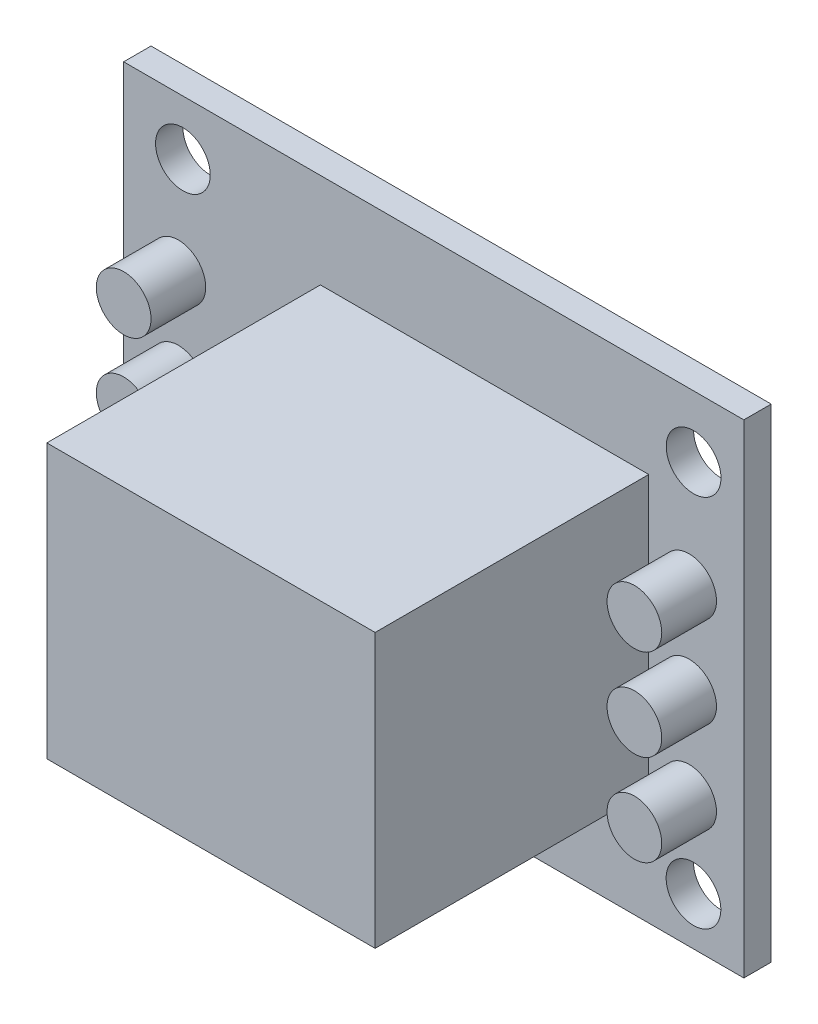
ISO-10303-21;
HEADER;
FILE_DESCRIPTION(('STEP AP214'),'2;1');
FILE_NAME('part.step','',(''),(''),'','','');
FILE_SCHEMA(('AUTOMOTIVE_DESIGN { 1 0 10303 214 1 1 1 1 }'));
ENDSEC;
DATA;
#1=APPLICATION_CONTEXT('core data for automotive mechanical design processes');
#2=APPLICATION_PROTOCOL_DEFINITION('international standard','automotive_design',2000,#1);
#3=PRODUCT_CONTEXT('',#1,'mechanical');
#4=PRODUCT('Part','Part','',(#3));
#5=PRODUCT_RELATED_PRODUCT_CATEGORY('part','',(#4));
#6=PRODUCT_DEFINITION_FORMATION('','',#4);
#7=PRODUCT_DEFINITION_CONTEXT('part definition',#1,'design');
#8=PRODUCT_DEFINITION('design','',#6,#7);
#9=PRODUCT_DEFINITION_SHAPE('','',#8);
#10=(LENGTH_UNIT() NAMED_UNIT(*) SI_UNIT(.MILLI.,.METRE.));
#11=(NAMED_UNIT(*) PLANE_ANGLE_UNIT() SI_UNIT($,.RADIAN.));
#12=(NAMED_UNIT(*) SI_UNIT($,.STERADIAN.) SOLID_ANGLE_UNIT());
#13=UNCERTAINTY_MEASURE_WITH_UNIT(LENGTH_MEASURE(1.E-05),#10,'distance_accuracy_value','');
#14=(GEOMETRIC_REPRESENTATION_CONTEXT(3) GLOBAL_UNCERTAINTY_ASSIGNED_CONTEXT((#13)) GLOBAL_UNIT_ASSIGNED_CONTEXT((#10,
#11,#12)) REPRESENTATION_CONTEXT('',''));
#15=CARTESIAN_POINT('',(0.,0.,0.));
#16=DIRECTION('',(0.,0.,1.));
#17=DIRECTION('',(1.,0.,0.));
#18=AXIS2_PLACEMENT_3D('',#15,#16,#17);
#19=CARTESIAN_POINT('',(0.,0.,1.5));
#20=DIRECTION('',(0.,0.,1.));
#21=DIRECTION('',(1.,0.,0.));
#22=AXIS2_PLACEMENT_3D('',#19,#20,#21);
#23=PLANE('',#22);
#24=CARTESIAN_POINT('',(16.28013764939,-5.89932861440915,1.5));
#25=DIRECTION('',(0.,0.,1.));
#26=DIRECTION('',(1.,0.,0.));
#27=AXIS2_PLACEMENT_3D('',#24,#25,#26);
#28=CIRCLE('',#27,1.5);
#29=CARTESIAN_POINT('',(17.78013764939,-5.89932861440915,1.5));
#30=VERTEX_POINT('',#29);
#31=EDGE_CURVE('E291',#30,#30,#28,.T.);
#32=ORIENTED_EDGE('',*,*,#31,.F.);
#33=EDGE_LOOP('',(#32));
#34=FACE_BOUND('',#33,.T.);
#35=CARTESIAN_POINT('',(16.28013764939,-0.899328614409152,1.5));
#36=DIRECTION('',(0.,0.,1.));
#37=DIRECTION('',(1.,0.,0.));
#38=AXIS2_PLACEMENT_3D('',#35,#36,#37);
#39=CIRCLE('',#38,1.5);
#40=CARTESIAN_POINT('',(17.78013764939,-0.899328614409152,1.5));
#41=VERTEX_POINT('',#40);
#42=EDGE_CURVE('E290',#41,#41,#39,.T.);
#43=ORIENTED_EDGE('',*,*,#42,.F.);
#44=EDGE_LOOP('',(#43));
#45=FACE_BOUND('',#44,.T.);
#46=CARTESIAN_POINT('',(16.28013764939,4.10067138559085,1.5));
#47=DIRECTION('',(0.,0.,1.));
#48=DIRECTION('',(1.,0.,0.));
#49=AXIS2_PLACEMENT_3D('',#46,#47,#48);
#50=CIRCLE('',#49,1.5);
#51=CARTESIAN_POINT('',(17.78013764939,4.10067138559085,1.5));
#52=VERTEX_POINT('',#51);
#53=EDGE_CURVE('E300',#52,#52,#50,.T.);
#54=ORIENTED_EDGE('',*,*,#53,.F.);
#55=EDGE_LOOP('',(#54));
#56=FACE_BOUND('',#55,.T.);
#57=CARTESIAN_POINT('',(-11.71986235061,-5.,1.5));
#58=DIRECTION('',(0.,0.,1.));
#59=DIRECTION('',(1.,0.,0.));
#60=AXIS2_PLACEMENT_3D('',#57,#58,#59);
#61=CIRCLE('',#60,1.5);
#62=CARTESIAN_POINT('',(-10.21986235061,-5.,1.5));
#63=VERTEX_POINT('',#62);
#64=EDGE_CURVE('E305',#63,#63,#61,.T.);
#65=ORIENTED_EDGE('',*,*,#64,.F.);
#66=EDGE_LOOP('',(#65));
#67=FACE_BOUND('',#66,.T.);
#68=CARTESIAN_POINT('',(-11.71986235061,0.,1.5));
#69=DIRECTION('',(0.,0.,1.));
#70=DIRECTION('',(1.,0.,0.));
#71=AXIS2_PLACEMENT_3D('',#68,#69,#70);
#72=CIRCLE('',#71,1.5);
#73=CARTESIAN_POINT('',(-10.21986235061,0.,1.5));
#74=VERTEX_POINT('',#73);
#75=EDGE_CURVE('E311',#74,#74,#72,.T.);
#76=ORIENTED_EDGE('',*,*,#75,.F.);
#77=EDGE_LOOP('',(#76));
#78=FACE_BOUND('',#77,.T.);
#79=CARTESIAN_POINT('',(-11.71986235061,5.,1.5));
#80=DIRECTION('',(0.,0.,1.));
#81=DIRECTION('',(1.,0.,0.));
#82=AXIS2_PLACEMENT_3D('',#79,#80,#81);
#83=CIRCLE('',#82,1.5);
#84=CARTESIAN_POINT('',(-10.21986235061,5.,1.5));
#85=VERTEX_POINT('',#84);
#86=EDGE_CURVE('E317',#85,#85,#83,.T.);
#87=ORIENTED_EDGE('',*,*,#86,.F.);
#88=EDGE_LOOP('',(#87));
#89=FACE_BOUND('',#88,.T.);
#90=CARTESIAN_POINT('',(16.52013764939,-10.4262328767123,1.5));
#91=DIRECTION('',(0.,0.,1.));
#92=DIRECTION('',(1.,0.,0.));
#93=AXIS2_PLACEMENT_3D('',#90,#91,#92);
#94=CIRCLE('',#93,1.5);
#95=CARTESIAN_POINT('',(18.02013764939,-10.4262328767123,1.5));
#96=VERTEX_POINT('',#95);
#97=EDGE_CURVE('E144',#96,#96,#94,.T.);
#98=ORIENTED_EDGE('',*,*,#97,.F.);
#99=EDGE_LOOP('',(#98));
#100=FACE_BOUND('',#99,.T.);
#101=CARTESIAN_POINT('',(-11.472215350492,10.4587665135316,1.5));
#102=DIRECTION('',(0.,0.,1.));
#103=DIRECTION('',(1.,0.,0.));
#104=AXIS2_PLACEMENT_3D('',#101,#102,#103);
#105=CIRCLE('',#104,1.5);
#106=CARTESIAN_POINT('',(-9.97221535049201,10.4587665135316,1.5));
#107=VERTEX_POINT('',#106);
#108=EDGE_CURVE('E156',#107,#107,#105,.T.);
#109=ORIENTED_EDGE('',*,*,#108,.F.);
#110=EDGE_LOOP('',(#109));
#111=FACE_BOUND('',#110,.T.);
#112=DIRECTION('',(0.,-1.,0.));
#113=VECTOR('',#112,1.);
#114=CARTESIAN_POINT('',(-14.71986235061,13.4587671232877,1.5));
#115=LINE('',#114,#113);
#116=CARTESIAN_POINT('',(-14.71986235061,13.4587671232877,1.5));
#117=VERTEX_POINT('',#116);
#118=CARTESIAN_POINT('',(-14.71986235061,-13.0412328767123,1.5));
#119=VERTEX_POINT('',#118);
#120=EDGE_CURVE('E162',#117,#119,#115,.T.);
#121=ORIENTED_EDGE('',*,*,#120,.T.);
#122=DIRECTION('',(1.,0.,0.));
#123=VECTOR('',#122,1.);
#124=CARTESIAN_POINT('',(-14.71986235061,-13.0412328767123,1.5));
#125=LINE('',#124,#123);
#126=CARTESIAN_POINT('',(19.28013764939,-13.0412328767123,1.5));
#127=VERTEX_POINT('',#126);
#128=EDGE_CURVE('E86',#119,#127,#125,.T.);
#129=ORIENTED_EDGE('',*,*,#128,.T.);
#130=DIRECTION('',(0.,1.,0.));
#131=VECTOR('',#130,1.);
#132=CARTESIAN_POINT('',(19.28013764939,13.4587671232877,1.5));
#133=LINE('',#132,#131);
#134=CARTESIAN_POINT('',(19.28013764939,13.4587671232877,1.5));
#135=VERTEX_POINT('',#134);
#136=EDGE_CURVE('E165',#127,#135,#133,.T.);
#137=ORIENTED_EDGE('',*,*,#136,.T.);
#138=DIRECTION('',(-1.,0.,0.));
#139=VECTOR('',#138,1.);
#140=CARTESIAN_POINT('',(-14.71986235061,13.4587671232877,1.5));
#141=LINE('',#140,#139);
#142=EDGE_CURVE('E58',#135,#117,#141,.T.);
#143=ORIENTED_EDGE('',*,*,#142,.T.);
#144=EDGE_LOOP('',(#121,#129,#137,#143));
#145=FACE_BOUND('',#144,.T.);
#146=CARTESIAN_POINT('',(-11.477215350492,-10.0412328767123,1.5));
#147=DIRECTION('',(0.,0.,1.));
#148=DIRECTION('',(1.,0.,0.));
#149=AXIS2_PLACEMENT_3D('',#146,#147,#148);
#150=CIRCLE('',#149,1.5);
#151=CARTESIAN_POINT('',(-9.97721535049202,-10.0412328767123,1.5));
#152=VERTEX_POINT('',#151);
#153=EDGE_CURVE('E150',#152,#152,#150,.T.);
#154=ORIENTED_EDGE('',*,*,#153,.F.);
#155=EDGE_LOOP('',(#154));
#156=FACE_BOUND('',#155,.T.);
#157=CARTESIAN_POINT('',(16.52513764939,10.0737665135316,1.5));
#158=DIRECTION('',(0.,0.,1.));
#159=DIRECTION('',(1.,0.,0.));
#160=AXIS2_PLACEMENT_3D('',#157,#158,#159);
#161=CIRCLE('',#160,1.5);
#162=CARTESIAN_POINT('',(18.02513764939,10.0737665135316,1.5));
#163=VERTEX_POINT('',#162);
#164=EDGE_CURVE('E136',#163,#163,#161,.T.);
#165=ORIENTED_EDGE('',*,*,#164,.F.);
#166=EDGE_LOOP('',(#165));
#167=FACE_BOUND('',#166,.T.);
#168=DIRECTION('',(1.,0.,0.));
#169=VECTOR('',#168,1.);
#170=CARTESIAN_POINT('',(-3.93328594625488,-6.74123287671233,1.5));
#171=LINE('',#170,#169);
#172=CARTESIAN_POINT('',(-3.93328594625488,-6.74123287671233,1.5));
#173=VERTEX_POINT('',#172);
#174=CARTESIAN_POINT('',(14.0667140537451,-6.74123287671233,1.5));
#175=VERTEX_POINT('',#174);
#176=EDGE_CURVE('E329',#173,#175,#171,.T.);
#177=ORIENTED_EDGE('',*,*,#176,.F.);
#178=DIRECTION('',(0.,-1.,0.));
#179=VECTOR('',#178,1.);
#180=CARTESIAN_POINT('',(-3.93328594625489,8.25876712328767,1.5));
#181=LINE('',#180,#179);
#182=CARTESIAN_POINT('',(-3.93328594625489,8.25876712328767,1.5));
#183=VERTEX_POINT('',#182);
#184=EDGE_CURVE('E131',#183,#173,#181,.T.);
#185=ORIENTED_EDGE('',*,*,#184,.F.);
#186=DIRECTION('',(-1.,0.,0.));
#187=VECTOR('',#186,1.);
#188=CARTESIAN_POINT('',(-3.93328594625489,8.25876712328767,1.5));
#189=LINE('',#188,#187);
#190=CARTESIAN_POINT('',(14.0667140537451,8.25876712328767,1.5));
#191=VERTEX_POINT('',#190);
#192=EDGE_CURVE('E127',#191,#183,#189,.T.);
#193=ORIENTED_EDGE('',*,*,#192,.F.);
#194=DIRECTION('',(0.,1.,0.));
#195=VECTOR('',#194,1.);
#196=CARTESIAN_POINT('',(14.0667140537451,8.25876712328767,1.5));
#197=LINE('',#196,#195);
#198=EDGE_CURVE('E331',#175,#191,#197,.T.);
#199=ORIENTED_EDGE('',*,*,#198,.F.);
#200=EDGE_LOOP('',(#177,#185,#193,#199));
#201=FACE_BOUND('',#200,.T.);
#202=ADVANCED_FACE('F34',(#34,#45,#56,#67,#78,#89,#100,#111,#145,#156,#167,#201),#23,.T.);
#203=CARTESIAN_POINT('',(0.,0.,0.));
#204=DIRECTION('',(0.,0.,1.));
#205=DIRECTION('',(1.,0.,0.));
#206=AXIS2_PLACEMENT_3D('',#203,#204,#205);
#207=PLANE('',#206);
#208=DIRECTION('',(0.,-1.,0.));
#209=VECTOR('',#208,1.);
#210=CARTESIAN_POINT('',(-14.71986235061,13.4587671232877,0.));
#211=LINE('',#210,#209);
#212=CARTESIAN_POINT('',(-14.71986235061,13.4587671232877,0.));
#213=VERTEX_POINT('',#212);
#214=CARTESIAN_POINT('',(-14.71986235061,-13.0412328767123,0.));
#215=VERTEX_POINT('',#214);
#216=EDGE_CURVE('E159',#213,#215,#211,.T.);
#217=ORIENTED_EDGE('',*,*,#216,.F.);
#218=DIRECTION('',(-1.,0.,0.));
#219=VECTOR('',#218,1.);
#220=CARTESIAN_POINT('',(-14.71986235061,13.4587671232877,0.));
#221=LINE('',#220,#219);
#222=CARTESIAN_POINT('',(19.28013764939,13.4587671232877,0.));
#223=VERTEX_POINT('',#222);
#224=EDGE_CURVE('E79',#223,#213,#221,.T.);
#225=ORIENTED_EDGE('',*,*,#224,.F.);
#226=DIRECTION('',(0.,1.,0.));
#227=VECTOR('',#226,1.);
#228=CARTESIAN_POINT('',(19.28013764939,13.4587671232877,0.));
#229=LINE('',#228,#227);
#230=CARTESIAN_POINT('',(19.28013764939,-13.0412328767123,0.));
#231=VERTEX_POINT('',#230);
#232=EDGE_CURVE('E173',#231,#223,#229,.T.);
#233=ORIENTED_EDGE('',*,*,#232,.F.);
#234=DIRECTION('',(1.,0.,0.));
#235=VECTOR('',#234,1.);
#236=CARTESIAN_POINT('',(-14.71986235061,-13.0412328767123,0.));
#237=LINE('',#236,#235);
#238=EDGE_CURVE('E171',#215,#231,#237,.T.);
#239=ORIENTED_EDGE('',*,*,#238,.F.);
#240=EDGE_LOOP('',(#217,#225,#233,#239));
#241=FACE_BOUND('',#240,.T.);
#242=CARTESIAN_POINT('',(-11.472215350492,10.4587665135316,0.));
#243=DIRECTION('',(0.,0.,1.));
#244=DIRECTION('',(1.,0.,0.));
#245=AXIS2_PLACEMENT_3D('',#242,#243,#244);
#246=CIRCLE('',#245,1.5);
#247=CARTESIAN_POINT('',(-9.97221535049201,10.4587665135316,0.));
#248=VERTEX_POINT('',#247);
#249=EDGE_CURVE('E153',#248,#248,#246,.T.);
#250=ORIENTED_EDGE('',*,*,#249,.T.);
#251=EDGE_LOOP('',(#250));
#252=FACE_BOUND('',#251,.T.);
#253=CARTESIAN_POINT('',(-11.477215350492,-10.0412328767123,0.));
#254=DIRECTION('',(0.,0.,1.));
#255=DIRECTION('',(1.,0.,0.));
#256=AXIS2_PLACEMENT_3D('',#253,#254,#255);
#257=CIRCLE('',#256,1.5);
#258=CARTESIAN_POINT('',(-9.97721535049202,-10.0412328767123,0.));
#259=VERTEX_POINT('',#258);
#260=EDGE_CURVE('E147',#259,#259,#257,.T.);
#261=ORIENTED_EDGE('',*,*,#260,.T.);
#262=EDGE_LOOP('',(#261));
#263=FACE_BOUND('',#262,.T.);
#264=CARTESIAN_POINT('',(16.52013764939,-10.4262328767123,0.));
#265=DIRECTION('',(0.,0.,1.));
#266=DIRECTION('',(1.,0.,0.));
#267=AXIS2_PLACEMENT_3D('',#264,#265,#266);
#268=CIRCLE('',#267,1.5);
#269=CARTESIAN_POINT('',(18.02013764939,-10.4262328767123,0.));
#270=VERTEX_POINT('',#269);
#271=EDGE_CURVE('E142',#270,#270,#268,.T.);
#272=ORIENTED_EDGE('',*,*,#271,.T.);
#273=EDGE_LOOP('',(#272));
#274=FACE_BOUND('',#273,.T.);
#275=CARTESIAN_POINT('',(16.52513764939,10.0737665135316,0.));
#276=DIRECTION('',(0.,0.,1.));
#277=DIRECTION('',(1.,0.,0.));
#278=AXIS2_PLACEMENT_3D('',#275,#276,#277);
#279=CIRCLE('',#278,1.5);
#280=CARTESIAN_POINT('',(18.02513764939,10.0737665135316,0.));
#281=VERTEX_POINT('',#280);
#282=EDGE_CURVE('E133',#281,#281,#279,.T.);
#283=ORIENTED_EDGE('',*,*,#282,.T.);
#284=EDGE_LOOP('',(#283));
#285=FACE_BOUND('',#284,.T.);
#286=ADVANCED_FACE('F186',(#241,#252,#263,#274,#285),#207,.F.);
#287=CARTESIAN_POINT('',(-14.71986235061,13.4587671232877,1.5));
#288=DIRECTION('',(1.,0.,0.));
#289=DIRECTION('',(0.,1.,0.));
#290=AXIS2_PLACEMENT_3D('',#287,#288,#289);
#291=PLANE('',#290);
#292=ORIENTED_EDGE('',*,*,#216,.T.);
#293=DIRECTION('',(0.,0.,-1.));
#294=VECTOR('',#293,1.);
#295=CARTESIAN_POINT('',(-14.71986235061,-13.0412328767123,1.5));
#296=LINE('',#295,#294);
#297=EDGE_CURVE('E11',#119,#215,#296,.T.);
#298=ORIENTED_EDGE('',*,*,#297,.F.);
#299=ORIENTED_EDGE('',*,*,#120,.F.);
#300=DIRECTION('',(0.,0.,-1.));
#301=VECTOR('',#300,1.);
#302=CARTESIAN_POINT('',(-14.71986235061,13.4587671232877,1.5));
#303=LINE('',#302,#301);
#304=EDGE_CURVE('E168',#117,#213,#303,.T.);
#305=ORIENTED_EDGE('',*,*,#304,.T.);
#306=EDGE_LOOP('',(#292,#298,#299,#305));
#307=FACE_BOUND('',#306,.T.);
#308=ADVANCED_FACE('F36',(#307),#291,.F.);
#309=CARTESIAN_POINT('',(-14.71986235061,-13.0412328767123,1.5));
#310=DIRECTION('',(0.,1.,0.));
#311=DIRECTION('',(0.,0.,1.));
#312=AXIS2_PLACEMENT_3D('',#309,#310,#311);
#313=PLANE('',#312);
#314=ORIENTED_EDGE('',*,*,#238,.T.);
#315=DIRECTION('',(0.,0.,-1.));
#316=VECTOR('',#315,1.);
#317=CARTESIAN_POINT('',(19.28013764939,-13.0412328767123,1.5));
#318=LINE('',#317,#316);
#319=EDGE_CURVE('E42',#127,#231,#318,.T.);
#320=ORIENTED_EDGE('',*,*,#319,.F.);
#321=ORIENTED_EDGE('',*,*,#128,.F.);
#322=ORIENTED_EDGE('',*,*,#297,.T.);
#323=EDGE_LOOP('',(#314,#320,#321,#322));
#324=FACE_BOUND('',#323,.T.);
#325=ADVANCED_FACE('F202',(#324),#313,.F.);
#326=CARTESIAN_POINT('',(19.28013764939,13.4587671232877,1.5));
#327=DIRECTION('',(-1.,0.,0.));
#328=DIRECTION('',(0.,-1.,0.));
#329=AXIS2_PLACEMENT_3D('',#326,#327,#328);
#330=PLANE('',#329);
#331=ORIENTED_EDGE('',*,*,#232,.T.);
#332=DIRECTION('',(0.,0.,-1.));
#333=VECTOR('',#332,1.);
#334=CARTESIAN_POINT('',(19.28013764939,13.4587671232877,1.5));
#335=LINE('',#334,#333);
#336=EDGE_CURVE('E177',#135,#223,#335,.T.);
#337=ORIENTED_EDGE('',*,*,#336,.F.);
#338=ORIENTED_EDGE('',*,*,#136,.F.);
#339=ORIENTED_EDGE('',*,*,#319,.T.);
#340=EDGE_LOOP('',(#331,#337,#338,#339));
#341=FACE_BOUND('',#340,.T.);
#342=ADVANCED_FACE('F182',(#341),#330,.F.);
#343=CARTESIAN_POINT('',(-14.71986235061,13.4587671232877,1.5));
#344=DIRECTION('',(0.,-1.,0.));
#345=DIRECTION('',(1.,0.,0.));
#346=AXIS2_PLACEMENT_3D('',#343,#344,#345);
#347=PLANE('',#346);
#348=ORIENTED_EDGE('',*,*,#224,.T.);
#349=ORIENTED_EDGE('',*,*,#304,.F.);
#350=ORIENTED_EDGE('',*,*,#142,.F.);
#351=ORIENTED_EDGE('',*,*,#336,.T.);
#352=EDGE_LOOP('',(#348,#349,#350,#351));
#353=FACE_BOUND('',#352,.T.);
#354=ADVANCED_FACE('F191',(#353),#347,.F.);
#355=CARTESIAN_POINT('',(-11.472215350492,10.4587665135316,1.5));
#356=DIRECTION('',(0.,0.,-1.));
#357=DIRECTION('',(-1.,0.,0.));
#358=AXIS2_PLACEMENT_3D('',#355,#356,#357);
#359=CYLINDRICAL_SURFACE('',#358,1.5);
#360=ORIENTED_EDGE('',*,*,#108,.T.);
#361=EDGE_LOOP('',(#360));
#362=FACE_BOUND('',#361,.T.);
#363=ORIENTED_EDGE('',*,*,#249,.F.);
#364=EDGE_LOOP('',(#363));
#365=FACE_BOUND('',#364,.T.);
#366=ADVANCED_FACE('F193',(#362,#365),#359,.F.);
#367=CARTESIAN_POINT('',(-11.477215350492,-10.0412328767123,1.5));
#368=DIRECTION('',(0.,0.,-1.));
#369=DIRECTION('',(-1.,0.,0.));
#370=AXIS2_PLACEMENT_3D('',#367,#368,#369);
#371=CYLINDRICAL_SURFACE('',#370,1.5);
#372=ORIENTED_EDGE('',*,*,#153,.T.);
#373=EDGE_LOOP('',(#372));
#374=FACE_BOUND('',#373,.T.);
#375=ORIENTED_EDGE('',*,*,#260,.F.);
#376=EDGE_LOOP('',(#375));
#377=FACE_BOUND('',#376,.T.);
#378=ADVANCED_FACE('F199',(#374,#377),#371,.F.);
#379=CARTESIAN_POINT('',(16.52013764939,-10.4262328767123,1.5));
#380=DIRECTION('',(0.,0.,-1.));
#381=DIRECTION('',(-1.,0.,0.));
#382=AXIS2_PLACEMENT_3D('',#379,#380,#381);
#383=CYLINDRICAL_SURFACE('',#382,1.5);
#384=ORIENTED_EDGE('',*,*,#97,.T.);
#385=EDGE_LOOP('',(#384));
#386=FACE_BOUND('',#385,.T.);
#387=ORIENTED_EDGE('',*,*,#271,.F.);
#388=EDGE_LOOP('',(#387));
#389=FACE_BOUND('',#388,.T.);
#390=ADVANCED_FACE('F216',(#386,#389),#383,.F.);
#391=CARTESIAN_POINT('',(16.52513764939,10.0737665135316,1.5));
#392=DIRECTION('',(0.,0.,-1.));
#393=DIRECTION('',(-1.,0.,0.));
#394=AXIS2_PLACEMENT_3D('',#391,#392,#393);
#395=CYLINDRICAL_SURFACE('',#394,1.5);
#396=ORIENTED_EDGE('',*,*,#164,.T.);
#397=EDGE_LOOP('',(#396));
#398=FACE_BOUND('',#397,.T.);
#399=ORIENTED_EDGE('',*,*,#282,.F.);
#400=EDGE_LOOP('',(#399));
#401=FACE_BOUND('',#400,.T.);
#402=ADVANCED_FACE('F220',(#398,#401),#395,.F.);
#403=CARTESIAN_POINT('',(-3.93328594625489,8.25876712328767,16.5));
#404=DIRECTION('',(1.,0.,0.));
#405=DIRECTION('',(0.,1.,0.));
#406=AXIS2_PLACEMENT_3D('',#403,#404,#405);
#407=PLANE('',#406);
#408=ORIENTED_EDGE('',*,*,#184,.T.);
#409=DIRECTION('',(0.,0.,-1.));
#410=VECTOR('',#409,1.);
#411=CARTESIAN_POINT('',(-3.93328594625488,-6.74123287671233,16.5));
#412=LINE('',#411,#410);
#413=CARTESIAN_POINT('',(-3.93328594625488,-6.74123287671233,16.5));
#414=VERTEX_POINT('',#413);
#415=EDGE_CURVE('E112',#414,#173,#412,.T.);
#416=ORIENTED_EDGE('',*,*,#415,.F.);
#417=DIRECTION('',(0.,-1.,0.));
#418=VECTOR('',#417,1.);
#419=CARTESIAN_POINT('',(-3.93328594625489,8.25876712328767,16.5));
#420=LINE('',#419,#418);
#421=CARTESIAN_POINT('',(-3.93328594625489,8.25876712328767,16.5));
#422=VERTEX_POINT('',#421);
#423=EDGE_CURVE('E119',#422,#414,#420,.T.);
#424=ORIENTED_EDGE('',*,*,#423,.F.);
#425=DIRECTION('',(0.,0.,-1.));
#426=VECTOR('',#425,1.);
#427=CARTESIAN_POINT('',(-3.93328594625489,8.25876712328767,16.5));
#428=LINE('',#427,#426);
#429=EDGE_CURVE('E327',#422,#183,#428,.T.);
#430=ORIENTED_EDGE('',*,*,#429,.T.);
#431=EDGE_LOOP('',(#408,#416,#424,#430));
#432=FACE_BOUND('',#431,.T.);
#433=ADVANCED_FACE('F129',(#432),#407,.F.);
#434=CARTESIAN_POINT('',(-3.93328594625488,-6.74123287671233,16.5));
#435=DIRECTION('',(0.,1.,0.));
#436=DIRECTION('',(0.,0.,1.));
#437=AXIS2_PLACEMENT_3D('',#434,#435,#436);
#438=PLANE('',#437);
#439=ORIENTED_EDGE('',*,*,#176,.T.);
#440=DIRECTION('',(0.,0.,-1.));
#441=VECTOR('',#440,1.);
#442=CARTESIAN_POINT('',(14.0667140537451,-6.74123287671233,16.5));
#443=LINE('',#442,#441);
#444=CARTESIAN_POINT('',(14.0667140537451,-6.74123287671233,16.5));
#445=VERTEX_POINT('',#444);
#446=EDGE_CURVE('E115',#445,#175,#443,.T.);
#447=ORIENTED_EDGE('',*,*,#446,.F.);
#448=DIRECTION('',(1.,0.,0.));
#449=VECTOR('',#448,1.);
#450=CARTESIAN_POINT('',(-3.93328594625488,-6.74123287671233,16.5));
#451=LINE('',#450,#449);
#452=EDGE_CURVE('E108',#414,#445,#451,.T.);
#453=ORIENTED_EDGE('',*,*,#452,.F.);
#454=ORIENTED_EDGE('',*,*,#415,.T.);
#455=EDGE_LOOP('',(#439,#447,#453,#454));
#456=FACE_BOUND('',#455,.T.);
#457=ADVANCED_FACE('F110',(#456),#438,.F.);
#458=CARTESIAN_POINT('',(14.0667140537451,8.25876712328767,16.5));
#459=DIRECTION('',(-1.,0.,0.));
#460=DIRECTION('',(0.,0.,1.));
#461=AXIS2_PLACEMENT_3D('',#458,#459,#460);
#462=PLANE('',#461);
#463=ORIENTED_EDGE('',*,*,#198,.T.);
#464=DIRECTION('',(0.,0.,-1.));
#465=VECTOR('',#464,1.);
#466=CARTESIAN_POINT('',(14.0667140537451,8.25876712328767,16.5));
#467=LINE('',#466,#465);
#468=CARTESIAN_POINT('',(14.0667140537451,8.25876712328767,16.5));
#469=VERTEX_POINT('',#468);
#470=EDGE_CURVE('E49',#469,#191,#467,.T.);
#471=ORIENTED_EDGE('',*,*,#470,.F.);
#472=DIRECTION('',(0.,1.,0.));
#473=VECTOR('',#472,1.);
#474=CARTESIAN_POINT('',(14.0667140537451,8.25876712328767,16.5));
#475=LINE('',#474,#473);
#476=EDGE_CURVE('E118',#445,#469,#475,.T.);
#477=ORIENTED_EDGE('',*,*,#476,.F.);
#478=ORIENTED_EDGE('',*,*,#446,.T.);
#479=EDGE_LOOP('',(#463,#471,#477,#478));
#480=FACE_BOUND('',#479,.T.);
#481=ADVANCED_FACE('F229',(#480),#462,.F.);
#482=CARTESIAN_POINT('',(-3.93328594625489,8.25876712328767,16.5));
#483=DIRECTION('',(0.,-1.,0.));
#484=DIRECTION('',(1.,0.,0.));
#485=AXIS2_PLACEMENT_3D('',#482,#483,#484);
#486=PLANE('',#485);
#487=ORIENTED_EDGE('',*,*,#192,.T.);
#488=ORIENTED_EDGE('',*,*,#429,.F.);
#489=DIRECTION('',(-1.,0.,0.));
#490=VECTOR('',#489,1.);
#491=CARTESIAN_POINT('',(-3.93328594625489,8.25876712328767,16.5));
#492=LINE('',#491,#490);
#493=EDGE_CURVE('E123',#469,#422,#492,.T.);
#494=ORIENTED_EDGE('',*,*,#493,.F.);
#495=ORIENTED_EDGE('',*,*,#470,.T.);
#496=EDGE_LOOP('',(#487,#488,#494,#495));
#497=FACE_BOUND('',#496,.T.);
#498=ADVANCED_FACE('F232',(#497),#486,.F.);
#499=CARTESIAN_POINT('',(0.,0.,16.5));
#500=DIRECTION('',(0.,0.,1.));
#501=DIRECTION('',(1.,0.,0.));
#502=AXIS2_PLACEMENT_3D('',#499,#500,#501);
#503=PLANE('',#502);
#504=ORIENTED_EDGE('',*,*,#423,.T.);
#505=ORIENTED_EDGE('',*,*,#452,.T.);
#506=ORIENTED_EDGE('',*,*,#476,.T.);
#507=ORIENTED_EDGE('',*,*,#493,.T.);
#508=EDGE_LOOP('',(#504,#505,#506,#507));
#509=FACE_BOUND('',#508,.T.);
#510=ADVANCED_FACE('F122',(#509),#503,.T.);
#511=CARTESIAN_POINT('',(-11.71986235061,5.,4.5));
#512=DIRECTION('',(0.,0.,-1.));
#513=DIRECTION('',(-1.,0.,0.));
#514=AXIS2_PLACEMENT_3D('',#511,#512,#513);
#515=CYLINDRICAL_SURFACE('',#514,1.5);
#516=CARTESIAN_POINT('',(-11.71986235061,5.,4.5));
#517=DIRECTION('',(0.,0.,1.));
#518=DIRECTION('',(1.,0.,0.));
#519=AXIS2_PLACEMENT_3D('',#516,#517,#518);
#520=CIRCLE('',#519,1.5);
#521=CARTESIAN_POINT('',(-10.21986235061,5.,4.5));
#522=VERTEX_POINT('',#521);
#523=EDGE_CURVE('E320',#522,#522,#520,.T.);
#524=ORIENTED_EDGE('',*,*,#523,.F.);
#525=EDGE_LOOP('',(#524));
#526=FACE_BOUND('',#525,.T.);
#527=ORIENTED_EDGE('',*,*,#86,.T.);
#528=EDGE_LOOP('',(#527));
#529=FACE_BOUND('',#528,.T.);
#530=ADVANCED_FACE('F238',(#526,#529),#515,.T.);
#531=CARTESIAN_POINT('',(-11.71986235061,5.,4.5));
#532=DIRECTION('',(0.,0.,1.));
#533=DIRECTION('',(1.,0.,0.));
#534=AXIS2_PLACEMENT_3D('',#531,#532,#533);
#535=PLANE('',#534);
#536=ORIENTED_EDGE('',*,*,#523,.T.);
#537=EDGE_LOOP('',(#536));
#538=FACE_BOUND('',#537,.T.);
#539=ADVANCED_FACE('F241',(#538),#535,.T.);
#540=CARTESIAN_POINT('',(-11.71986235061,0.,4.5));
#541=DIRECTION('',(0.,0.,-1.));
#542=DIRECTION('',(-1.,0.,0.));
#543=AXIS2_PLACEMENT_3D('',#540,#541,#542);
#544=CYLINDRICAL_SURFACE('',#543,1.5);
#545=CARTESIAN_POINT('',(-11.71986235061,0.,4.5));
#546=DIRECTION('',(0.,0.,1.));
#547=DIRECTION('',(1.,0.,0.));
#548=AXIS2_PLACEMENT_3D('',#545,#546,#547);
#549=CIRCLE('',#548,1.5);
#550=CARTESIAN_POINT('',(-10.21986235061,0.,4.5));
#551=VERTEX_POINT('',#550);
#552=EDGE_CURVE('E314',#551,#551,#549,.T.);
#553=ORIENTED_EDGE('',*,*,#552,.F.);
#554=EDGE_LOOP('',(#553));
#555=FACE_BOUND('',#554,.T.);
#556=ORIENTED_EDGE('',*,*,#75,.T.);
#557=EDGE_LOOP('',(#556));
#558=FACE_BOUND('',#557,.T.);
#559=ADVANCED_FACE('F245',(#555,#558),#544,.T.);
#560=CARTESIAN_POINT('',(-11.71986235061,0.,4.5));
#561=DIRECTION('',(0.,0.,1.));
#562=DIRECTION('',(1.,0.,0.));
#563=AXIS2_PLACEMENT_3D('',#560,#561,#562);
#564=PLANE('',#563);
#565=ORIENTED_EDGE('',*,*,#552,.T.);
#566=EDGE_LOOP('',(#565));
#567=FACE_BOUND('',#566,.T.);
#568=ADVANCED_FACE('F249',(#567),#564,.T.);
#569=CARTESIAN_POINT('',(-11.71986235061,-5.,4.5));
#570=DIRECTION('',(0.,0.,-1.));
#571=DIRECTION('',(-1.,0.,0.));
#572=AXIS2_PLACEMENT_3D('',#569,#570,#571);
#573=CYLINDRICAL_SURFACE('',#572,1.5);
#574=CARTESIAN_POINT('',(-11.71986235061,-5.,4.5));
#575=DIRECTION('',(0.,0.,1.));
#576=DIRECTION('',(1.,0.,0.));
#577=AXIS2_PLACEMENT_3D('',#574,#575,#576);
#578=CIRCLE('',#577,1.5);
#579=CARTESIAN_POINT('',(-10.21986235061,-5.,4.5));
#580=VERTEX_POINT('',#579);
#581=EDGE_CURVE('E308',#580,#580,#578,.T.);
#582=ORIENTED_EDGE('',*,*,#581,.F.);
#583=EDGE_LOOP('',(#582));
#584=FACE_BOUND('',#583,.T.);
#585=ORIENTED_EDGE('',*,*,#64,.T.);
#586=EDGE_LOOP('',(#585));
#587=FACE_BOUND('',#586,.T.);
#588=ADVANCED_FACE('F253',(#584,#587),#573,.T.);
#589=CARTESIAN_POINT('',(-11.71986235061,-5.,4.5));
#590=DIRECTION('',(0.,0.,1.));
#591=DIRECTION('',(1.,0.,0.));
#592=AXIS2_PLACEMENT_3D('',#589,#590,#591);
#593=PLANE('',#592);
#594=ORIENTED_EDGE('',*,*,#581,.T.);
#595=EDGE_LOOP('',(#594));
#596=FACE_BOUND('',#595,.T.);
#597=ADVANCED_FACE('F257',(#596),#593,.T.);
#598=CARTESIAN_POINT('',(16.28013764939,4.10067138559085,4.5));
#599=DIRECTION('',(0.,0.,-1.));
#600=DIRECTION('',(-1.,0.,0.));
#601=AXIS2_PLACEMENT_3D('',#598,#599,#600);
#602=CYLINDRICAL_SURFACE('',#601,1.5);
#603=CARTESIAN_POINT('',(16.28013764939,4.10067138559085,4.5));
#604=DIRECTION('',(0.,0.,1.));
#605=DIRECTION('',(1.,0.,0.));
#606=AXIS2_PLACEMENT_3D('',#603,#604,#605);
#607=CIRCLE('',#606,1.5);
#608=CARTESIAN_POINT('',(17.78013764939,4.10067138559085,4.5));
#609=VERTEX_POINT('',#608);
#610=EDGE_CURVE('E302',#609,#609,#607,.T.);
#611=ORIENTED_EDGE('',*,*,#610,.F.);
#612=EDGE_LOOP('',(#611));
#613=FACE_BOUND('',#612,.T.);
#614=ORIENTED_EDGE('',*,*,#53,.T.);
#615=EDGE_LOOP('',(#614));
#616=FACE_BOUND('',#615,.T.);
#617=ADVANCED_FACE('F261',(#613,#616),#602,.T.);
#618=CARTESIAN_POINT('',(16.28013764939,4.10067138559085,4.5));
#619=DIRECTION('',(0.,0.,1.));
#620=DIRECTION('',(1.,0.,0.));
#621=AXIS2_PLACEMENT_3D('',#618,#619,#620);
#622=PLANE('',#621);
#623=ORIENTED_EDGE('',*,*,#610,.T.);
#624=EDGE_LOOP('',(#623));
#625=FACE_BOUND('',#624,.T.);
#626=ADVANCED_FACE('F265',(#625),#622,.T.);
#627=CARTESIAN_POINT('',(16.28013764939,-0.899328614409152,4.5));
#628=DIRECTION('',(0.,0.,-1.));
#629=DIRECTION('',(-1.,0.,0.));
#630=AXIS2_PLACEMENT_3D('',#627,#628,#629);
#631=CYLINDRICAL_SURFACE('',#630,1.5);
#632=CARTESIAN_POINT('',(16.28013764939,-0.899328614409152,4.5));
#633=DIRECTION('',(0.,0.,1.));
#634=DIRECTION('',(1.,0.,0.));
#635=AXIS2_PLACEMENT_3D('',#632,#633,#634);
#636=CIRCLE('',#635,1.5);
#637=CARTESIAN_POINT('',(17.78013764939,-0.899328614409152,4.5));
#638=VERTEX_POINT('',#637);
#639=EDGE_CURVE('E294',#638,#638,#636,.T.);
#640=ORIENTED_EDGE('',*,*,#639,.F.);
#641=EDGE_LOOP('',(#640));
#642=FACE_BOUND('',#641,.T.);
#643=ORIENTED_EDGE('',*,*,#42,.T.);
#644=EDGE_LOOP('',(#643));
#645=FACE_BOUND('',#644,.T.);
#646=ADVANCED_FACE('F269',(#642,#645),#631,.T.);
#647=CARTESIAN_POINT('',(16.28013764939,-0.899328614409152,4.5));
#648=DIRECTION('',(0.,0.,1.));
#649=DIRECTION('',(1.,0.,0.));
#650=AXIS2_PLACEMENT_3D('',#647,#648,#649);
#651=PLANE('',#650);
#652=ORIENTED_EDGE('',*,*,#639,.T.);
#653=EDGE_LOOP('',(#652));
#654=FACE_BOUND('',#653,.T.);
#655=ADVANCED_FACE('F273',(#654),#651,.T.);
#656=CARTESIAN_POINT('',(16.28013764939,-5.89932861440915,4.5));
#657=DIRECTION('',(0.,0.,-1.));
#658=DIRECTION('',(-1.,0.,0.));
#659=AXIS2_PLACEMENT_3D('',#656,#657,#658);
#660=CYLINDRICAL_SURFACE('',#659,1.5);
#661=CARTESIAN_POINT('',(16.28013764939,-5.89932861440915,4.5));
#662=DIRECTION('',(0.,0.,1.));
#663=DIRECTION('',(1.,0.,0.));
#664=AXIS2_PLACEMENT_3D('',#661,#662,#663);
#665=CIRCLE('',#664,1.5);
#666=CARTESIAN_POINT('',(17.78013764939,-5.89932861440915,4.5));
#667=VERTEX_POINT('',#666);
#668=EDGE_CURVE('E289',#667,#667,#665,.T.);
#669=ORIENTED_EDGE('',*,*,#668,.F.);
#670=EDGE_LOOP('',(#669));
#671=FACE_BOUND('',#670,.T.);
#672=ORIENTED_EDGE('',*,*,#31,.T.);
#673=EDGE_LOOP('',(#672));
#674=FACE_BOUND('',#673,.T.);
#675=ADVANCED_FACE('F277',(#671,#674),#660,.T.);
#676=CARTESIAN_POINT('',(16.28013764939,-5.89932861440915,4.5));
#677=DIRECTION('',(0.,0.,1.));
#678=DIRECTION('',(1.,0.,0.));
#679=AXIS2_PLACEMENT_3D('',#676,#677,#678);
#680=PLANE('',#679);
#681=ORIENTED_EDGE('',*,*,#668,.T.);
#682=EDGE_LOOP('',(#681));
#683=FACE_BOUND('',#682,.T.);
#684=ADVANCED_FACE('F281',(#683),#680,.T.);
#685=CLOSED_SHELL('',(#202,#286,#308,#325,#342,#354,#366,#378,#390,#402,#433,#457,#481,#498,
#510,#530,#539,#559,#568,#588,#597,#617,#626,#646,#655,#675,#684));
#686=MANIFOLD_SOLID_BREP('B2',#685);
#687=ADVANCED_BREP_SHAPE_REPRESENTATION('',(#18,#686),#14);
#688=SHAPE_DEFINITION_REPRESENTATION(#9,#687);
ENDSEC;
END-ISO-10303-21;
